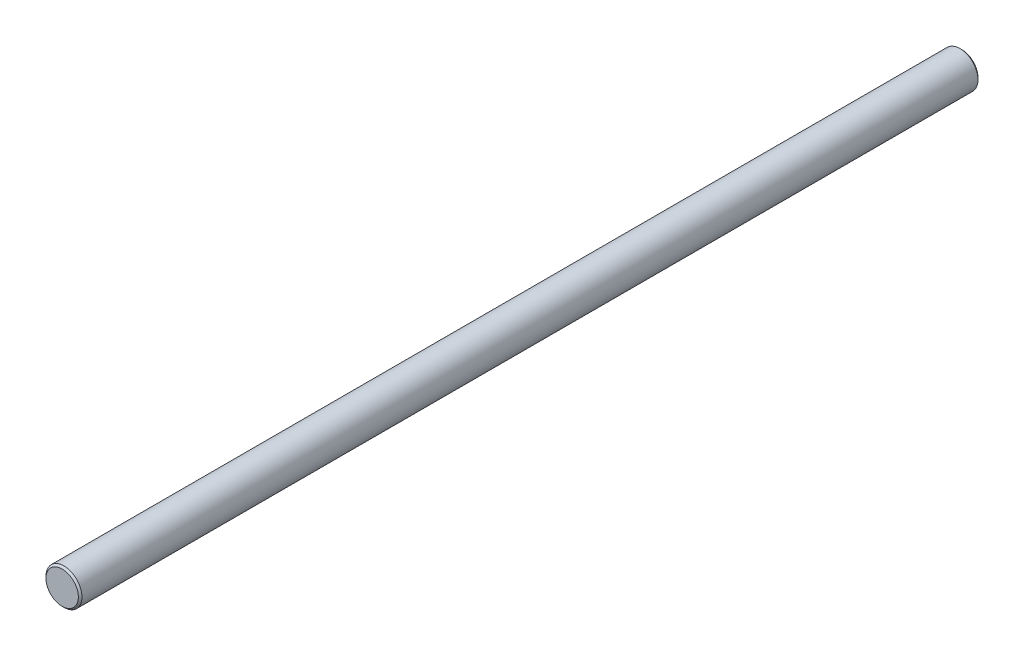
ISO-10303-21;
HEADER;
FILE_DESCRIPTION(('STEP AP214'),'2;1');
FILE_NAME('part.step','',(''),(''),'','','');
FILE_SCHEMA(('AUTOMOTIVE_DESIGN { 1 0 10303 214 1 1 1 1 }'));
ENDSEC;
DATA;
#1=APPLICATION_CONTEXT('core data for automotive mechanical design processes');
#2=APPLICATION_PROTOCOL_DEFINITION('international standard','automotive_design',2000,#1);
#3=PRODUCT_CONTEXT('',#1,'mechanical');
#4=PRODUCT('Part','Part','',(#3));
#5=PRODUCT_RELATED_PRODUCT_CATEGORY('part','',(#4));
#6=PRODUCT_DEFINITION_FORMATION('','',#4);
#7=PRODUCT_DEFINITION_CONTEXT('part definition',#1,'design');
#8=PRODUCT_DEFINITION('design','',#6,#7);
#9=PRODUCT_DEFINITION_SHAPE('','',#8);
#10=(LENGTH_UNIT() NAMED_UNIT(*) SI_UNIT(.MILLI.,.METRE.));
#11=(NAMED_UNIT(*) PLANE_ANGLE_UNIT() SI_UNIT($,.RADIAN.));
#12=(NAMED_UNIT(*) SI_UNIT($,.STERADIAN.) SOLID_ANGLE_UNIT());
#13=UNCERTAINTY_MEASURE_WITH_UNIT(LENGTH_MEASURE(1.E-05),#10,'distance_accuracy_value','');
#14=(GEOMETRIC_REPRESENTATION_CONTEXT(3) GLOBAL_UNCERTAINTY_ASSIGNED_CONTEXT((#13)) GLOBAL_UNIT_ASSIGNED_CONTEXT((#10,
#11,#12)) REPRESENTATION_CONTEXT('',''));
#15=CARTESIAN_POINT('',(0.,0.,0.));
#16=DIRECTION('',(0.,0.,1.));
#17=DIRECTION('',(1.,0.,0.));
#18=AXIS2_PLACEMENT_3D('',#15,#16,#17);
#19=CARTESIAN_POINT('',(0.,0.,250.));
#20=DIRECTION('',(0.,0.,-1.));
#21=DIRECTION('',(-1.,0.,0.));
#22=AXIS2_PLACEMENT_3D('',#19,#20,#21);
#23=CYLINDRICAL_SURFACE('',#22,10.);
#24=CARTESIAN_POINT('',(0.,0.,-249.));
#25=DIRECTION('',(0.,0.,1.));
#26=DIRECTION('',(1.,0.,0.));
#27=AXIS2_PLACEMENT_3D('',#24,#25,#26);
#28=CIRCLE('',#27,10.);
#29=CARTESIAN_POINT('',(10.,0.,-249.));
#30=VERTEX_POINT('',#29);
#31=EDGE_CURVE('E61',#30,#30,#28,.T.);
#32=ORIENTED_EDGE('',*,*,#31,.T.);
#33=EDGE_LOOP('',(#32));
#34=FACE_BOUND('',#33,.T.);
#35=CARTESIAN_POINT('',(0.,0.,249.));
#36=DIRECTION('',(0.,0.,1.));
#37=DIRECTION('',(1.,0.,0.));
#38=AXIS2_PLACEMENT_3D('',#35,#36,#37);
#39=CIRCLE('',#38,10.);
#40=CARTESIAN_POINT('',(10.,0.,249.));
#41=VERTEX_POINT('',#40);
#42=EDGE_CURVE('E65',#41,#41,#39,.F.);
#43=ORIENTED_EDGE('',*,*,#42,.T.);
#44=EDGE_LOOP('',(#43));
#45=FACE_BOUND('',#44,.T.);
#46=ADVANCED_FACE('F50',(#34,#45),#23,.T.);
#47=CARTESIAN_POINT('',(0.,0.,250.));
#48=DIRECTION('',(0.,0.,1.));
#49=DIRECTION('',(1.,0.,0.));
#50=AXIS2_PLACEMENT_3D('',#47,#48,#49);
#51=PLANE('',#50);
#52=CARTESIAN_POINT('',(0.,0.,250.));
#53=DIRECTION('',(0.,0.,1.));
#54=DIRECTION('',(1.,0.,0.));
#55=AXIS2_PLACEMENT_3D('',#52,#53,#54);
#56=CIRCLE('',#55,8.9999999999999);
#57=CARTESIAN_POINT('',(8.9999999999999,0.,250.));
#58=VERTEX_POINT('',#57);
#59=EDGE_CURVE('E11',#58,#58,#56,.T.);
#60=ORIENTED_EDGE('',*,*,#59,.T.);
#61=EDGE_LOOP('',(#60));
#62=FACE_BOUND('',#61,.T.);
#63=ADVANCED_FACE('F81',(#62),#51,.T.);
#64=CARTESIAN_POINT('',(0.,0.,-250.));
#65=DIRECTION('',(0.,0.,1.));
#66=DIRECTION('',(1.,0.,0.));
#67=AXIS2_PLACEMENT_3D('',#64,#65,#66);
#68=PLANE('',#67);
#69=CARTESIAN_POINT('',(0.,0.,-250.));
#70=DIRECTION('',(0.,0.,1.));
#71=DIRECTION('',(1.,0.,0.));
#72=AXIS2_PLACEMENT_3D('',#69,#70,#71);
#73=CIRCLE('',#72,9.00000000000006);
#74=CARTESIAN_POINT('',(9.00000000000006,0.,-250.));
#75=VERTEX_POINT('',#74);
#76=EDGE_CURVE('E57',#75,#75,#73,.F.);
#77=ORIENTED_EDGE('',*,*,#76,.T.);
#78=EDGE_LOOP('',(#77));
#79=FACE_BOUND('',#78,.T.);
#80=ADVANCED_FACE('F78',(#79),#68,.F.);
#81=CARTESIAN_POINT('',(0.,0.,-249.));
#82=DIRECTION('',(0.,0.,1.));
#83=DIRECTION('',(1.,0.,0.));
#84=AXIS2_PLACEMENT_3D('',#81,#82,#83);
#85=CONICAL_SURFACE('',#84,10.,0.785398163397472);
#86=ORIENTED_EDGE('',*,*,#76,.F.);
#87=EDGE_LOOP('',(#86));
#88=FACE_BOUND('',#87,.T.);
#89=ORIENTED_EDGE('',*,*,#31,.F.);
#90=EDGE_LOOP('',(#89));
#91=FACE_BOUND('',#90,.T.);
#92=ADVANCED_FACE('F74',(#88,#91),#85,.T.);
#93=CARTESIAN_POINT('',(0.,0.,250.));
#94=DIRECTION('',(0.,0.,-1.));
#95=DIRECTION('',(-1.,0.,0.));
#96=AXIS2_PLACEMENT_3D('',#93,#94,#95);
#97=CONICAL_SURFACE('',#96,8.9999999999999,0.785398163397458);
#98=ORIENTED_EDGE('',*,*,#42,.F.);
#99=EDGE_LOOP('',(#98));
#100=FACE_BOUND('',#99,.T.);
#101=ORIENTED_EDGE('',*,*,#59,.F.);
#102=EDGE_LOOP('',(#101));
#103=FACE_BOUND('',#102,.T.);
#104=ADVANCED_FACE('F52',(#100,#103),#97,.T.);
#105=CLOSED_SHELL('',(#46,#63,#80,#92,#104));
#106=MANIFOLD_SOLID_BREP('B2',#105);
#107=ADVANCED_BREP_SHAPE_REPRESENTATION('',(#18,#106),#14);
#108=SHAPE_DEFINITION_REPRESENTATION(#9,#107);
ENDSEC;
END-ISO-10303-21;
